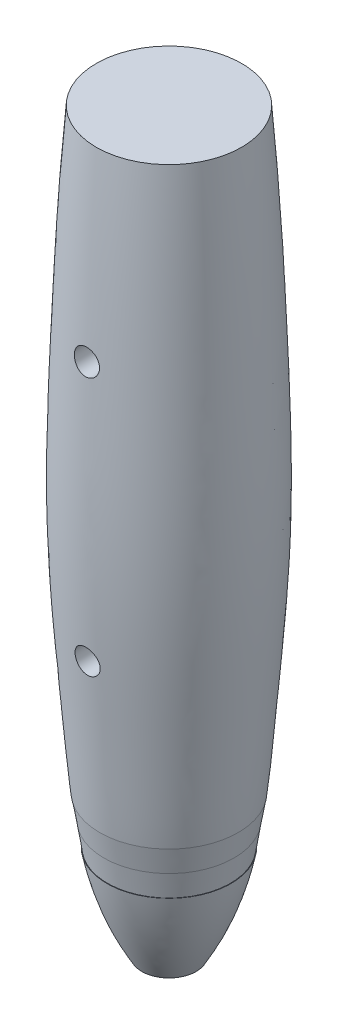
ISO-10303-21;
HEADER;
FILE_DESCRIPTION(('STEP AP214'),'2;1');
FILE_NAME('part.step','',(''),(''),'','','');
FILE_SCHEMA(('AUTOMOTIVE_DESIGN { 1 0 10303 214 1 1 1 1 }'));
ENDSEC;
DATA;
#1=APPLICATION_CONTEXT('core data for automotive mechanical design processes');
#2=APPLICATION_PROTOCOL_DEFINITION('international standard','automotive_design',2000,#1);
#3=PRODUCT_CONTEXT('',#1,'mechanical');
#4=PRODUCT('Part','Part','',(#3));
#5=PRODUCT_RELATED_PRODUCT_CATEGORY('part','',(#4));
#6=PRODUCT_DEFINITION_FORMATION('','',#4);
#7=PRODUCT_DEFINITION_CONTEXT('part definition',#1,'design');
#8=PRODUCT_DEFINITION('design','',#6,#7);
#9=PRODUCT_DEFINITION_SHAPE('','',#8);
#10=(LENGTH_UNIT() NAMED_UNIT(*) SI_UNIT(.MILLI.,.METRE.));
#11=(NAMED_UNIT(*) PLANE_ANGLE_UNIT() SI_UNIT($,.RADIAN.));
#12=(NAMED_UNIT(*) SI_UNIT($,.STERADIAN.) SOLID_ANGLE_UNIT());
#13=UNCERTAINTY_MEASURE_WITH_UNIT(LENGTH_MEASURE(1.E-05),#10,'distance_accuracy_value','');
#14=(GEOMETRIC_REPRESENTATION_CONTEXT(3) GLOBAL_UNCERTAINTY_ASSIGNED_CONTEXT((#13)) GLOBAL_UNIT_ASSIGNED_CONTEXT((#10,
#11,#12)) REPRESENTATION_CONTEXT('',''));
#15=CARTESIAN_POINT('',(0.,0.,0.));
#16=DIRECTION('',(0.,0.,1.));
#17=DIRECTION('',(1.,0.,0.));
#18=AXIS2_PLACEMENT_3D('',#15,#16,#17);
#19=CARTESIAN_POINT('',(0.,790.340820313,-61.387008667));
#20=DIRECTION('',(0.,-1.,0.));
#21=DIRECTION('',(0.,0.,-1.));
#22=AXIS2_PLACEMENT_3D('',#19,#20,#21);
#23=PLANE('',#22);
#24=CARTESIAN_POINT('',(0.,790.340820313,0.));
#25=DIRECTION('',(0.,1.,0.));
#26=DIRECTION('',(0.,0.,1.));
#27=AXIS2_PLACEMENT_3D('',#24,#25,#26);
#28=CIRCLE('',#27,61.387008667);
#29=CARTESIAN_POINT('',(0.,790.340820313,61.387008667));
#30=VERTEX_POINT('',#29);
#31=EDGE_CURVE('E17',#30,#30,#28,.T.);
#32=ORIENTED_EDGE('',*,*,#31,.F.);
#33=EDGE_LOOP('',(#32));
#34=FACE_BOUND('',#33,.T.);
#35=ADVANCED_FACE('F14',(#34),#23,.T.);
#36=CARTESIAN_POINT('',(0.,1001.95002223,-140.174366178));
#37=CARTESIAN_POINT('',(0.,986.483221142,-137.046208978));
#38=CARTESIAN_POINT('',(0.,971.113061691,-133.586775008));
#39=CARTESIAN_POINT('',(0.,955.85359643,-129.756142439));
#40=CARTESIAN_POINT('',(0.,912.421196022,-117.599863487));
#41=CARTESIAN_POINT('',(0.,870.066313188,-101.915123625));
#42=CARTESIAN_POINT('',(0.,842.981803926,-90.0511989518));
#43=CARTESIAN_POINT('',(0.,816.406639634,-76.5418272993));
#44=CARTESIAN_POINT('',(0.,790.340820313,-61.387008667));
#45=(BOUNDED_CURVE() B_SPLINE_CURVE(5,(#36,#37,#38,#39,#40,#41,#42,#43,#44),.UNSPECIFIED.,.F.,
.F.) B_SPLINE_CURVE_WITH_KNOTS((6,3,6),(1455.4877488,1534.58198638,1682.43854308),
.UNSPECIFIED.) CURVE() GEOMETRIC_REPRESENTATION_ITEM() RATIONAL_B_SPLINE_CURVE((1.,1.,1.,1.,1.,
1.,1.,1.,1.)) REPRESENTATION_ITEM(''));
#46=CARTESIAN_POINT('',(0.,1622.67712402,0.));
#47=DIRECTION('',(0.,1.,0.));
#48=AXIS1_PLACEMENT('',#46,#47);
#49=SURFACE_OF_REVOLUTION('',#45,#48);
#50=CARTESIAN_POINT('',(0.,1001.95002223886,0.));
#51=DIRECTION('',(0.,1.,0.));
#52=DIRECTION('',(0.479425538604204,0.,-0.877582561890372));
#53=AXIS2_PLACEMENT_3D('',#50,#51,#52);
#54=CIRCLE('',#53,140.174366176558);
#55=CARTESIAN_POINT('',(67.2031710026992,1001.95002223886,-123.014579380583));
#56=VERTEX_POINT('',#55);
#57=EDGE_CURVE('E29',#56,#56,#54,.F.);
#58=ORIENTED_EDGE('',*,*,#57,.T.);
#59=EDGE_LOOP('',(#58));
#60=FACE_BOUND('',#59,.T.);
#61=ORIENTED_EDGE('',*,*,#31,.T.);
#62=EDGE_LOOP('',(#61));
#63=FACE_BOUND('',#62,.T.);
#64=ADVANCED_FACE('F78',(#60,#63),#49,.F.);
#65=CARTESIAN_POINT('',(0.,1001.95002223886,0.));
#66=DIRECTION('',(0.,1.,0.));
#67=DIRECTION('',(0.,0.,1.));
#68=AXIS2_PLACEMENT_3D('',#65,#66,#67);
#69=CONICAL_SURFACE('',#68,140.174366176558,1.40482936173);
#70=CARTESIAN_POINT('',(0.,1001.74414062994,0.));
#71=DIRECTION('',(0.,1.,0.));
#72=DIRECTION('',(0.479425538604204,0.,-0.877582561890372));
#73=AXIS2_PLACEMENT_3D('',#70,#71,#72);
#74=CIRCLE('',#73,138.945279473991);
#75=CARTESIAN_POINT('',(66.6139154483299,1001.74414062994,-121.935954323359));
#76=VERTEX_POINT('',#75);
#77=EDGE_CURVE('E70',#76,#76,#74,.T.);
#78=ORIENTED_EDGE('',*,*,#77,.F.);
#79=EDGE_LOOP('',(#78));
#80=FACE_BOUND('',#79,.T.);
#81=ORIENTED_EDGE('',*,*,#57,.F.);
#82=EDGE_LOOP('',(#81));
#83=FACE_BOUND('',#82,.T.);
#84=ADVANCED_FACE('F81',(#80,#83),#69,.F.);
#85=CARTESIAN_POINT('',(0.,1055.30861804015,0.));
#86=DIRECTION('',(0.,1.,0.));
#87=DIRECTION('',(0.,0.,1.));
#88=AXIS2_PLACEMENT_3D('',#85,#86,#87);
#89=CONICAL_SURFACE('',#88,147.046676341265,0.150108012671);
#90=CARTESIAN_POINT('',(0.,1055.30861804004,0.));
#91=DIRECTION('',(0.,1.,0.));
#92=DIRECTION('',(0.479425538604204,0.,-0.877582561890372));
#93=AXIS2_PLACEMENT_3D('',#90,#91,#92);
#94=CIRCLE('',#93,147.046676342007);
#95=CARTESIAN_POINT('',(70.4979320052249,1055.30861804004,-129.045598941683));
#96=VERTEX_POINT('',#95);
#97=EDGE_CURVE('E63',#96,#96,#94,.T.);
#98=ORIENTED_EDGE('',*,*,#97,.F.);
#99=EDGE_LOOP('',(#98));
#100=FACE_BOUND('',#99,.T.);
#101=ORIENTED_EDGE('',*,*,#77,.T.);
#102=EDGE_LOOP('',(#101));
#103=FACE_BOUND('',#102,.T.);
#104=ADVANCED_FACE('F85',(#100,#103),#89,.T.);
#105=CARTESIAN_POINT('',(0.,0.,117.));
#106=DIRECTION('',(0.,0.,1.));
#107=DIRECTION('',(1.,0.,0.));
#108=AXIS2_PLACEMENT_3D('',#105,#106,#107);
#109=PLANE('',#108);
#110=CARTESIAN_POINT('',(0.028076171875,2046.74123752,117.));
#111=DIRECTION('',(0.,0.,1.));
#112=DIRECTION('',(1.,0.,0.));
#113=AXIS2_PLACEMENT_3D('',#110,#111,#112);
#114=CIRCLE('',#113,28.4182066159);
#115=CARTESIAN_POINT('',(28.446282787775,2046.74123752,117.));
#116=VERTEX_POINT('',#115);
#117=EDGE_CURVE('E69',#116,#116,#114,.T.);
#118=ORIENTED_EDGE('',*,*,#117,.T.);
#119=EDGE_LOOP('',(#118));
#120=FACE_BOUND('',#119,.T.);
#121=ADVANCED_FACE('F89',(#120),#109,.T.);
#122=CARTESIAN_POINT('',(0.,0.,117.));
#123=DIRECTION('',(0.,0.,1.));
#124=DIRECTION('',(1.,0.,0.));
#125=AXIS2_PLACEMENT_3D('',#122,#123,#124);
#126=PLANE('',#125);
#127=CARTESIAN_POINT('',(0.028076171875,1459.93544728,117.));
#128=DIRECTION('',(0.,0.,1.));
#129=DIRECTION('',(1.,0.,0.));
#130=AXIS2_PLACEMENT_3D('',#127,#128,#129);
#131=CIRCLE('',#130,28.4182066159);
#132=CARTESIAN_POINT('',(28.446282787775,1459.93544728,117.));
#133=VERTEX_POINT('',#132);
#134=EDGE_CURVE('E127',#133,#133,#131,.T.);
#135=ORIENTED_EDGE('',*,*,#134,.T.);
#136=EDGE_LOOP('',(#135));
#137=FACE_BOUND('',#136,.T.);
#138=ADVANCED_FACE('F93',(#137),#126,.T.);
#139=CARTESIAN_POINT('',(0.,1109.85107421989,0.));
#140=DIRECTION('',(0.,1.,0.));
#141=DIRECTION('',(0.,0.,1.));
#142=AXIS2_PLACEMENT_3D('',#139,#140,#141);
#143=CONICAL_SURFACE('',#142,156.119563454498,0.164836084889);
#144=CARTESIAN_POINT('',(0.,1109.85107421989,0.));
#145=DIRECTION('',(0.,1.,0.));
#146=DIRECTION('',(0.,0.,1.));
#147=AXIS2_PLACEMENT_3D('',#144,#145,#146);
#148=CIRCLE('',#147,156.119563454498);
#149=CARTESIAN_POINT('',(0.,1109.85107421989,156.119563454498));
#150=VERTEX_POINT('',#149);
#151=EDGE_CURVE('E125',#150,#150,#148,.T.);
#152=ORIENTED_EDGE('',*,*,#151,.F.);
#153=EDGE_LOOP('',(#152));
#154=FACE_BOUND('',#153,.T.);
#155=ORIENTED_EDGE('',*,*,#97,.T.);
#156=EDGE_LOOP('',(#155));
#157=FACE_BOUND('',#156,.T.);
#158=ADVANCED_FACE('F97',(#154,#157),#143,.T.);
#159=CARTESIAN_POINT('',(0.028076171875,2046.74123752,158.5));
#160=DIRECTION('',(0.,0.,1.));
#161=DIRECTION('',(1.,0.,0.));
#162=AXIS2_PLACEMENT_3D('',#159,#160,#161);
#163=CYLINDRICAL_SURFACE('',#162,28.4182066159);
#164=ORIENTED_EDGE('',*,*,#117,.F.);
#165=EDGE_LOOP('',(#164));
#166=FACE_BOUND('',#165,.T.);
#167=CARTESIAN_POINT('',(28.446282787775,2046.74123752,185.346258582128));
#168=CARTESIAN_POINT('',(28.4462786471396,2045.94483901186,185.378171314834));
#169=CARTESIAN_POINT('',(28.412776814294,2045.14852606646,185.415180715683));
#170=CARTESIAN_POINT('',(28.2790863277804,2043.56172394539,185.498998191778));
#171=CARTESIAN_POINT('',(28.1788659380677,2042.77123772234,185.54581092291));
#172=CARTESIAN_POINT('',(27.9123134906861,2041.20052700142,185.648627538126));
#173=CARTESIAN_POINT('',(27.7458556522178,2040.4203249616,185.704648789137));
#174=CARTESIAN_POINT('',(27.3481878326515,2038.87735512763,185.824844711864));
#175=CARTESIAN_POINT('',(27.1169855922408,2038.11458526112,185.889018408391));
#176=CARTESIAN_POINT('',(26.5919332907841,2036.61266349972,186.02423332169));
#177=CARTESIAN_POINT('',(26.2981641596627,2035.87348249959,186.09526560265));
#178=CARTESIAN_POINT('',(25.6499625507424,2034.42277108482,186.242867620589));
#179=CARTESIAN_POINT('',(25.29552836074,2033.7112414513,186.319437513826));
#180=CARTESIAN_POINT('',(24.5287004592565,2032.32097980089,186.476515647094));
#181=CARTESIAN_POINT('',(24.1163307851379,2031.64223433803,186.557022244806));
#182=CARTESIAN_POINT('',(23.2364008325867,2030.32181025189,186.720316910556));
#183=CARTESIAN_POINT('',(22.7688405604151,2029.68013162439,186.803104978335));
#184=CARTESIAN_POINT('',(21.7772276235138,2028.43250726109,186.969952243131));
#185=CARTESIAN_POINT('',(21.2526992680976,2027.82694015673,187.054016150125));
#186=CARTESIAN_POINT('',(20.1543010474419,2026.6621349152,187.220810110359));
#187=CARTESIAN_POINT('',(19.5804307860762,2026.10289715005,187.303540152884));
#188=CARTESIAN_POINT('',(18.3872138515512,2025.03460627451,187.465817798036));
#189=CARTESIAN_POINT('',(17.767862711789,2024.5255581047,187.545365086902));
#190=CARTESIAN_POINT('',(16.4879727802831,2023.56132748423,187.699457120071));
#191=CARTESIAN_POINT('',(15.8274340855658,2023.10614490669,187.774001876159));
#192=CARTESIAN_POINT('',(14.4686222961379,2022.25226053745,187.916481997108));
#193=CARTESIAN_POINT('',(13.7702901076722,2021.85365094686,187.984406517319));
#194=CARTESIAN_POINT('',(12.3417496670726,2021.1167601951,188.111913243275));
#195=CARTESIAN_POINT('',(11.6115413252425,2020.77847920371,188.171495425543));
#196=CARTESIAN_POINT('',(10.1244951651324,2020.1648628738,188.280893219916));
#197=CARTESIAN_POINT('',(9.36765952609578,2019.88952239785,188.330709629093));
#198=CARTESIAN_POINT('',(7.83276638416964,2019.40391543966,188.419379882596));
#199=CARTESIAN_POINT('',(7.05470915620674,2019.19364811483,188.458233868866));
#200=CARTESIAN_POINT('',(5.49378647217645,2018.84228196039,188.523584764322));
#201=CARTESIAN_POINT('',(4.71113113323639,2018.70027933942,188.550242897892));
#202=CARTESIAN_POINT('',(3.13635739590697,2018.48234712616,188.591337125647));
#203=CARTESIAN_POINT('',(2.3442390798998,2018.40641695907,188.605773326154));
#204=CARTESIAN_POINT('',(0.756351388292667,2018.32124096762,188.622077479251));
#205=CARTESIAN_POINT('',(-0.0394177308019849,2018.31199052802,188.62394630169));
#206=CARTESIAN_POINT('',(-1.62885684669376,2018.3602370134,188.61507478362));
#207=CARTESIAN_POINT('',(-2.42252685544751,2018.41773355736,188.604334515089));
#208=CARTESIAN_POINT('',(-3.99277909366924,2018.59795317343,188.570703639246));
#209=CARTESIAN_POINT('',(-4.76945267247163,2018.71990834399,188.547956079996));
#210=CARTESIAN_POINT('',(-6.30961678236103,2019.02761622009,188.490935317616));
#211=CARTESIAN_POINT('',(-7.0731074364694,2019.21336832994,188.456662222101));
#212=CARTESIAN_POINT('',(-8.58159757403528,2019.6472536634,188.377388568428));
#213=CARTESIAN_POINT('',(-9.32659654833829,2019.89538860258,188.332387715249));
#214=CARTESIAN_POINT('',(-10.7929550980116,2020.45217477324,188.232697549387));
#215=CARTESIAN_POINT('',(-11.5143144803382,2020.76082649878,188.17800815761));
#216=CARTESIAN_POINT('',(-12.9324384953268,2021.43826410684,188.059859551122));
#217=CARTESIAN_POINT('',(-13.6290437125682,2021.80737543469,187.996353174587));
#218=CARTESIAN_POINT('',(-14.9886915329435,2022.60182745464,187.862249545085));
#219=CARTESIAN_POINT('',(-15.6517340561997,2023.02716828055,187.791652275244));
#220=CARTESIAN_POINT('',(-16.9398339892109,2023.93107412261,187.644950796793));
#221=CARTESIAN_POINT('',(-17.5648914919065,2024.40963900852,187.568846601658));
#222=CARTESIAN_POINT('',(-18.772894929141,2025.41668995512,187.412813926477));
#223=CARTESIAN_POINT('',(-19.355840483318,2025.94517646663,187.3328854119));
#224=CARTESIAN_POINT('',(-20.4843355949021,2027.05692072044,187.169709109746));
#225=CARTESIAN_POINT('',(-21.0291781587851,2027.64089161139,187.086429273563));
#226=CARTESIAN_POINT('',(-22.0677895093481,2028.85258368143,186.919566549768));
#227=CARTESIAN_POINT('',(-22.561557391912,2029.48030563467,186.835983656819));
#228=CARTESIAN_POINT('',(-23.4948510853418,2030.77552943468,186.670295578448));
#229=CARTESIAN_POINT('',(-23.9343494046551,2031.44305119118,186.588191159825));
#230=CARTESIAN_POINT('',(-24.7557218814707,2032.8130051342,186.42726502752));
#231=CARTESIAN_POINT('',(-25.1375977151614,2033.51543630444,186.348443218399));
#232=CARTESIAN_POINT('',(-25.8433117071683,2034.95511712427,186.195229670945));
#233=CARTESIAN_POINT('',(-26.1667529969093,2035.69256483631,186.120870360551));
#234=CARTESIAN_POINT('',(-26.7501157789456,2037.1928982233,185.978668786614));
#235=CARTESIAN_POINT('',(-27.010029160956,2037.95578713208,185.910827355846));
#236=CARTESIAN_POINT('',(-27.4638261889925,2039.49995610607,185.783133463842));
#237=CARTESIAN_POINT('',(-27.6578386618087,2040.28119706001,185.723265556499));
#238=CARTESIAN_POINT('',(-27.9789098938061,2041.85761636682,185.612480291133));
#239=CARTESIAN_POINT('',(-28.106001464251,2042.65278769166,185.561558554986));
#240=CARTESIAN_POINT('',(-28.2627125670773,2043.99759900436,185.484086045319));
#241=CARTESIAN_POINT('',(-28.3104674262301,2044.54504345839,185.454930520694));
#242=CARTESIAN_POINT('',(-28.3741779955541,2045.64201992499,185.401333093684));
#243=CARTESIAN_POINT('',(-28.3901332454042,2046.19155196767,185.376891259537));
#244=CARTESIAN_POINT('',(-28.3901264164626,2047.53152425262,185.323204855113));
#245=CARTESIAN_POINT('',(-28.3571370771991,2048.32212828987,185.296540840488));
#246=CARTESIAN_POINT('',(-28.2252893426327,2049.89841228006,185.253330733551));
#247=CARTESIAN_POINT('',(-28.1264003621174,2050.68408977552,185.236789346176));
#248=CARTESIAN_POINT('',(-27.8631381041388,2052.24605230904,185.213639281911));
#249=CARTESIAN_POINT('',(-27.6986443889696,2053.02231735189,185.207048980396));
#250=CARTESIAN_POINT('',(-27.3053539745084,2054.55830200415,185.20339929414));
#251=CARTESIAN_POINT('',(-27.0765648334779,2055.31802354702,185.20633878955));
#252=CARTESIAN_POINT('',(-26.5565682038694,2056.8148805743,185.221014512614));
#253=CARTESIAN_POINT('',(-26.2654213882965,2057.55203722279,185.232742217002));
#254=CARTESIAN_POINT('',(-25.6226590718485,2058.99934649256,185.264029171916));
#255=CARTESIAN_POINT('',(-25.2710418515898,2059.70949834528,185.283588645147));
#256=CARTESIAN_POINT('',(-24.510014420448,2061.0975170668,185.32937540366));
#257=CARTESIAN_POINT('',(-24.1006281274957,2061.7753971424,185.355599933013));
#258=CARTESIAN_POINT('',(-23.2268541959821,2063.09448038297,185.413409835065));
#259=CARTESIAN_POINT('',(-22.7624667056716,2063.73568364679,185.444995193315));
#260=CARTESIAN_POINT('',(-21.7796236737543,2064.97993813093,185.512260368993));
#261=CARTESIAN_POINT('',(-21.2609227204655,2065.58279449356,185.547958851104));
#262=CARTESIAN_POINT('',(-20.1749210733814,2066.74285402099,185.621812054365));
#263=CARTESIAN_POINT('',(-19.6076201662231,2067.30005698534,185.659966786298));
#264=CARTESIAN_POINT('',(-18.4283091486379,2068.36501143127,185.73719439987));
#265=CARTESIAN_POINT('',(-17.8162943265395,2068.87275768823,185.776267377973));
#266=CARTESIAN_POINT('',(-16.5518543394199,2069.83521203175,185.853805101833));
#267=CARTESIAN_POINT('',(-15.8994290478256,2070.28991995217,185.892269845685));
#268=CARTESIAN_POINT('',(-14.5543873525577,2071.14586260784,185.967372459365));
#269=CARTESIAN_POINT('',(-13.8615400769018,2071.5467357965,186.00399703456));
#270=CARTESIAN_POINT('',(-12.4443654965027,2072.2886912069,186.073773478809));
#271=CARTESIAN_POINT('',(-11.7200380424838,2072.62977314507,186.106925331393));
#272=CARTESIAN_POINT('',(-10.2450405351443,2073.24967945818,186.168524799402));
#273=CARTESIAN_POINT('',(-9.49437117427157,2073.52850546822,186.196972538373));
#274=CARTESIAN_POINT('',(-7.97200730338381,2074.02187856287,186.248118948886));
#275=CARTESIAN_POINT('',(-7.2003128832687,2074.23642592227,186.270817645007));
#276=CARTESIAN_POINT('',(-5.64353074148354,2074.599169877,186.309584053135));
#277=CARTESIAN_POINT('',(-4.85848507516515,2074.74754504876,186.325669602504));
#278=CARTESIAN_POINT('',(-3.27857779498826,2074.97769924663,186.350715176336));
#279=CARTESIAN_POINT('',(-2.48371619390008,2075.05947835937,186.359675210068));
#280=CARTESIAN_POINT('',(-0.889903673572894,2075.15583136774,186.370144105381));
#281=CARTESIAN_POINT('',(-0.0909528718049292,2075.17040718319,186.371653179816));
#282=CARTESIAN_POINT('',(1.50531704722503,2075.13225027183,186.367163037609));
#283=CARTESIAN_POINT('',(2.30263616941717,2075.07951774868,186.361163843685));
#284=CARTESIAN_POINT('',(3.88598543142602,2074.90756511574,186.341917191554));
#285=CARTESIAN_POINT('',(4.67205191224974,2074.78867534955,186.328705752484));
#286=CARTESIAN_POINT('',(6.23132540366814,2074.48551573736,186.295526392677));
#287=CARTESIAN_POINT('',(7.00453246074356,2074.30124612775,186.275558496366));
#288=CARTESIAN_POINT('',(8.53265241611609,2073.86866349064,186.229576158054));
#289=CARTESIAN_POINT('',(9.28756486024229,2073.62034887499,186.203561566111));
#290=CARTESIAN_POINT('',(10.7737833009876,2073.06146835418,186.146418180347));
#291=CARTESIAN_POINT('',(11.5050892119025,2072.75090222305,186.11528936796));
#292=CARTESIAN_POINT('',(12.9407233815976,2072.06891152496,186.048963350698));
#293=CARTESIAN_POINT('',(13.6449823656391,2071.69734207136,186.01375652037));
#294=CARTESIAN_POINT('',(15.0197460454601,2070.89650888558,185.940630862055));
#295=CARTESIAN_POINT('',(15.6902506880414,2070.46724506247,185.902712029794));
#296=CARTESIAN_POINT('',(16.9928192040357,2069.55405377392,185.8255844169));
#297=CARTESIAN_POINT('',(17.6248846750981,2069.07012858276,185.786375689983));
#298=CARTESIAN_POINT('',(18.8462149075553,2068.05097025135,185.708170939182));
#299=CARTESIAN_POINT('',(19.4354796022184,2067.51573703111,185.66917491563));
#300=CARTESIAN_POINT('',(20.5699700524786,2066.39484122369,185.592747389672));
#301=CARTESIAN_POINT('',(21.1149577977024,2065.80893709035,185.555324805555));
#302=CARTESIAN_POINT('',(22.1536985436713,2064.59314476379,185.483819053867));
#303=CARTESIAN_POINT('',(22.6474509730905,2063.96325608022,185.449735923537));
#304=CARTESIAN_POINT('',(23.5803944657051,2062.66363969556,185.386408526493));
#305=CARTESIAN_POINT('',(24.0195616188399,2061.99389472478,185.357166378434));
#306=CARTESIAN_POINT('',(24.8399009027789,2060.61957385715,185.304955685803));
#307=CARTESIAN_POINT('',(25.2210749534922,2059.91499911439,185.281986933526));
#308=CARTESIAN_POINT('',(25.9219728651953,2058.4774534907,185.243629589831));
#309=CARTESIAN_POINT('',(26.2418172232153,2057.74454176287,185.228226039758));
#310=CARTESIAN_POINT('',(26.8186938727345,2056.25416641886,185.206003584077));
#311=CARTESIAN_POINT('',(27.0757187392487,2055.49669991239,185.19918569286));
#312=CARTESIAN_POINT('',(27.5246004201879,2053.96425244888,185.194986980698));
#313=CARTESIAN_POINT('',(27.7165802618692,2053.18930754689,185.197588234019));
#314=CARTESIAN_POINT('',(28.0345929467794,2051.62641593325,185.212770418049));
#315=CARTESIAN_POINT('',(28.1606570891469,2050.83847557599,185.225346605149));
#316=CARTESIAN_POINT('',(28.317626317704,2049.49824646909,185.255322978425));
#317=CARTESIAN_POINT('',(28.3658630707981,2048.94786487354,185.270057429334));
#318=CARTESIAN_POINT('',(28.430192529686,2047.84538763897,185.304464489672));
#319=CARTESIAN_POINT('',(28.446285658017,2047.29329202258,185.324137034185));
#320=CARTESIAN_POINT('',(28.446282787775,2046.74123752,185.346258582128));
#321=B_SPLINE_CURVE_WITH_KNOTS('',3,(#167,#168,#169,#170,#171,#172,#173,#174,#175,#176,#177,
#178,#179,#180,#181,#182,#183,#184,#185,#186,#187,#188,#189,#190,#191,#192,#193,#194,#195,#196,
#197,#198,#199,#200,#201,#202,#203,#204,#205,#206,#207,#208,#209,#210,#211,#212,#213,#214,#215,
#216,#217,#218,#219,#220,#221,#222,#223,#224,#225,#226,#227,#228,#229,#230,#231,#232,#233,#234,
#235,#236,#237,#238,#239,#240,#241,#242,#243,#244,#245,#246,#247,#248,#249,#250,#251,#252,#253,
#254,#255,#256,#257,#258,#259,#260,#261,#262,#263,#264,#265,#266,#267,#268,#269,#270,#271,#272,
#273,#274,#275,#276,#277,#278,#279,#280,#281,#282,#283,#284,#285,#286,#287,#288,#289,#290,#291,
#292,#293,#294,#295,#296,#297,#298,#299,#300,#301,#302,#303,#304,#305,#306,#307,#308,#309,#310,
#311,#312,#313,#314,#315,#316,#317,#318,#319,#320),.UNSPECIFIED.,.T.,.F.,(4,2,2,2,2,2,2,2,2,2,2,
2,2,2,2,2,2,2,2,2,2,2,2,2,2,2,2,2,2,2,2,2,2,2,2,2,2,2,2,2,2,2,2,2,2,2,2,2,2,2,2,2,2,2,2,2,2,2,2,
2,2,2,2,2,2,2,2,2,2,2,2,2,2,2,2,2,4),(0.,2.39060253273863,4.78234301770174,7.17864711037366,
9.57466482883527,11.9676019328068,14.3606065858937,16.7526213002828,19.1446357433106,
21.5584338990899,23.9722514351165,26.3863063460836,28.8003555704346,31.2182950448714,
33.6362413235803,36.0539901698625,38.4717077089616,40.856468420436,43.241208385916,
45.6257832900855,48.010344582226,50.3671182514657,52.7238699156967,55.0806863994913,
57.4375221245369,59.8074884986616,62.1774605129327,64.5474267281939,66.9174143467041,
69.3235929447932,71.7298141293948,74.1372492856944,76.544614398268,78.9677606736355,
81.3912161383811,83.8099064583626,86.2274097896346,87.8774164509725,89.5274469971097,
91.8997073622387,94.2730695037155,96.6508088873644,99.0282688722275,101.403426051356,
103.778650775621,106.152894963479,108.527132751925,110.912603528698,113.298084778674,
115.683817759229,118.069558212718,120.47059530069,122.871643775362,125.272629181049,
127.673604322106,130.068060241519,132.462513046122,134.856897446756,137.251274601997,
139.633801806811,142.016320398041,144.398898075761,146.781484402515,149.169813629283,
151.558146620036,153.946380276429,156.334617656293,158.734943626894,161.135296360695,
163.536696846218,165.938017814099,168.334571345952,170.731408002966,173.123685599029,
175.514826221925,177.171986836027,178.829125666133),.UNSPECIFIED.);
#322=CARTESIAN_POINT('',(28.446282787775,2046.74123752,185.346258582128));
#323=VERTEX_POINT('',#322);
#324=EDGE_CURVE('E39',#323,#323,#321,.T.);
#325=ORIENTED_EDGE('',*,*,#324,.F.);
#326=EDGE_LOOP('',(#325));
#327=FACE_BOUND('',#326,.T.);
#328=ADVANCED_FACE('F100',(#166,#327),#163,.F.);
#329=CARTESIAN_POINT('',(0.028076171875,1459.93544728,158.5));
#330=DIRECTION('',(0.,0.,1.));
#331=DIRECTION('',(1.,0.,0.));
#332=AXIS2_PLACEMENT_3D('',#329,#330,#331);
#333=CYLINDRICAL_SURFACE('',#332,28.4182066159);
#334=ORIENTED_EDGE('',*,*,#134,.F.);
#335=EDGE_LOOP('',(#334));
#336=FACE_BOUND('',#335,.T.);
#337=CARTESIAN_POINT('',(28.446282787775,1459.93544727999,183.818235619119));
#338=CARTESIAN_POINT('',(28.4462774821403,1459.14637559806,183.762141780714));
#339=CARTESIAN_POINT('',(28.4133902681603,1458.35682626623,183.710943784396));
#340=CARTESIAN_POINT('',(28.28186933556,1456.78232462613,183.618665961212));
#341=CARTESIAN_POINT('',(28.1832053440584,1455.99737460251,183.577590805175));
#342=CARTESIAN_POINT('',(27.920438007058,1454.43653830851,183.505548422461));
#343=CARTESIAN_POINT('',(27.7562156478648,1453.66067117835,183.474599766239));
#344=CARTESIAN_POINT('',(27.3634346106396,1452.1251580126,183.422669380735));
#345=CARTESIAN_POINT('',(27.1348834622755,1451.36551008975,183.401686485734));
#346=CARTESIAN_POINT('',(26.6152214364509,1449.86839628839,183.369176940913));
#347=CARTESIAN_POINT('',(26.324160730484,1449.13091315796,183.357642742904));
#348=CARTESIAN_POINT('',(25.6814085578567,1447.68274938747,183.343241827234));
#349=CARTESIAN_POINT('',(25.3297153531059,1446.97206951647,183.340375358087));
#350=CARTESIAN_POINT('',(24.5683543896003,1445.58287477345,183.342337279439));
#351=CARTESIAN_POINT('',(24.1587108475964,1444.90434662292,183.347162464293));
#352=CARTESIAN_POINT('',(23.2842417434128,1443.58392485706,183.363356283033));
#353=CARTESIAN_POINT('',(22.819416429642,1442.94203107684,183.374724887463));
#354=CARTESIAN_POINT('',(21.8368141440627,1441.69804041887,183.402759029009));
#355=CARTESIAN_POINT('',(21.3189264837369,1441.09603122939,183.419435798079));
#356=CARTESIAN_POINT('',(20.2346719020223,1439.93751222312,183.4567078102));
#357=CARTESIAN_POINT('',(19.6683048539979,1439.3810025252,183.477303063487));
#358=CARTESIAN_POINT('',(18.4909991516219,1438.31729782369,183.521002894767));
#359=CARTESIAN_POINT('',(17.8800559107046,1437.81010790729,183.544107731098));
#360=CARTESIAN_POINT('',(16.6179111371898,1436.8486282333,183.591418945605));
#361=CARTESIAN_POINT('',(15.9667094442844,1436.39433868637,183.615625328169));
#362=CARTESIAN_POINT('',(14.6242494639264,1435.53906028475,183.663939412927));
#363=CARTESIAN_POINT('',(13.9327593588632,1435.13843513663,183.688045464513));
#364=CARTESIAN_POINT('',(12.5184615290142,1434.39680381418,183.734711517914));
#365=CARTESIAN_POINT('',(11.7956536668172,1434.05579790146,183.757271512943));
#366=CARTESIAN_POINT('',(10.3238329996702,1433.43583408623,183.799691511151));
#367=CARTESIAN_POINT('',(9.57482052678249,1433.15687539778,183.819551548528));
#368=CARTESIAN_POINT('',(8.05588565980404,1432.66299765216,183.855588744435));
#369=CARTESIAN_POINT('',(7.28596330323579,1432.44807848007,183.871765909574));
#370=CARTESIAN_POINT('',(5.73054646682671,1432.08379725547,183.899657684607));
#371=CARTESIAN_POINT('',(4.9450494145168,1431.93444612869,183.911371550729));
#372=CARTESIAN_POINT('',(3.36420718133804,1431.70243613217,183.929776381906));
#373=CARTESIAN_POINT('',(2.56886199508735,1431.61977729886,183.936467344215));
#374=CARTESIAN_POINT('',(0.974020807194115,1431.52175467204,183.944513419835));
#375=CARTESIAN_POINT('',(0.174524871071708,1431.50638981951,183.945868617116));
#376=CARTESIAN_POINT('',(-1.42290918839702,1431.54306465705,183.94318415664));
#377=CARTESIAN_POINT('',(-2.22084731496196,1431.59510420771,183.93914451004));
#378=CARTESIAN_POINT('',(-3.80719920473961,1431.76596467234,183.92588570158));
#379=CARTESIAN_POINT('',(-4.59563359905748,1431.8845952687,183.916681300647));
#380=CARTESIAN_POINT('',(-6.1596832828904,1432.18764337346,183.893545115282));
#381=CARTESIAN_POINT('',(-6.93529859649195,1432.37206075822,183.879613339733));
#382=CARTESIAN_POINT('',(-8.46824003778971,1432.8053623091,183.847695727662));
#383=CARTESIAN_POINT('',(-9.2255657392829,1433.05424797594,183.829709796767));
#384=CARTESIAN_POINT('',(-10.7165697206728,1433.61470720234,183.790568877766));
#385=CARTESIAN_POINT('',(-11.4502479489033,1433.92628089885,183.769413882737));
#386=CARTESIAN_POINT('',(-12.8898479525766,1434.61040535945,183.724970687113));
#387=CARTESIAN_POINT('',(-13.5957276849361,1434.98304439501,183.701679420266));
#388=CARTESIAN_POINT('',(-14.9736314020295,1435.78634342247,183.654213947125));
#389=CARTESIAN_POINT('',(-15.6456553435099,1436.21700348849,183.630039739702));
#390=CARTESIAN_POINT('',(-16.9510851280745,1437.1332885405,183.582147043681));
#391=CARTESIAN_POINT('',(-17.5844931614063,1437.61891040466,183.55842852929));
#392=CARTESIAN_POINT('',(-18.8082723975586,1438.64173016873,183.512854449992));
#393=CARTESIAN_POINT('',(-19.3986436323129,1439.17892803037,183.490998883703));
#394=CARTESIAN_POINT('',(-20.5333527247354,1440.30229167034,183.450544478488));
#395=CARTESIAN_POINT('',(-21.0775928285747,1440.88855644779,183.431952470153));
#396=CARTESIAN_POINT('',(-22.1147940074403,1442.10495035396,183.399505437362));
#397=CARTESIAN_POINT('',(-22.6077546205429,1442.73507987771,183.385650455576));
#398=CARTESIAN_POINT('',(-23.5390509559294,1444.03499069577,183.364030292377));
#399=CARTESIAN_POINT('',(-23.9773637820633,1444.70478843793,183.356267656351));
#400=CARTESIAN_POINT('',(-24.7959495401908,1446.07897577496,183.348085024788));
#401=CARTESIAN_POINT('',(-25.1762244065053,1446.78336421592,183.347664784486));
#402=CARTESIAN_POINT('',(-25.8747427644365,1448.21907216505,183.355233367534));
#403=CARTESIAN_POINT('',(-26.1932047725757,1448.95028552128,183.363191904997));
#404=CARTESIAN_POINT('',(-26.7675556083612,1450.43683901949,183.38834064368));
#405=CARTESIAN_POINT('',(-27.0234372155145,1451.19218193417,183.405531909438));
#406=CARTESIAN_POINT('',(-27.4703582035305,1452.71998240992,183.449734502959));
#407=CARTESIAN_POINT('',(-27.6615177749625,1453.49240537818,183.476727433332));
#408=CARTESIAN_POINT('',(-27.9782878617265,1455.04984698724,183.54089272552));
#409=CARTESIAN_POINT('',(-28.103928970659,1455.83485957254,183.578060323926));
#410=CARTESIAN_POINT('',(-28.2609870579139,1457.17319902395,183.649839207929));
#411=CARTESIAN_POINT('',(-28.3094132578131,1457.72473218095,183.68181901786));
#412=CARTESIAN_POINT('',(-28.3739860108737,1458.82936394146,183.750702031066));
#413=CARTESIAN_POINT('',(-28.3901333250647,1459.38246250775,183.787605118244));
#414=CARTESIAN_POINT('',(-28.3901262768508,1460.73529187895,183.883777103801));
#415=CARTESIAN_POINT('',(-28.3563340956771,1461.53489840801,183.945676170813));
#416=CARTESIAN_POINT('',(-28.2215585381344,1463.12794970362,184.078948360258));
#417=CARTESIAN_POINT('',(-28.1205428998612,1463.92139132644,184.150326018488));
#418=CARTESIAN_POINT('',(-27.851958076597,1465.49769040911,184.301785474776));
#419=CARTESIAN_POINT('',(-27.6842605740764,1466.2805244354,184.381883837219));
#420=CARTESIAN_POINT('',(-27.283725610068,1467.82841944043,184.549504716931));
#421=CARTESIAN_POINT('',(-27.0508959923932,1468.5934825473,184.637026339339));
#422=CARTESIAN_POINT('',(-26.5222543508398,1470.09962664112,184.818003290412));
#423=CARTESIAN_POINT('',(-26.2265276537306,1470.84073856695,184.911450461074));
#424=CARTESIAN_POINT('',(-25.5740808536353,1472.29502700252,185.102830523438));
#425=CARTESIAN_POINT('',(-25.2173590252964,1473.00820272135,185.200763541972));
#426=CARTESIAN_POINT('',(-24.4456259490277,1474.40148726458,185.399367286316));
#427=CARTESIAN_POINT('',(-24.0306391206055,1475.08160978201,185.500036851028));
#428=CARTESIAN_POINT('',(-23.1451281990946,1476.40452847405,185.702342044069));
#429=CARTESIAN_POINT('',(-22.6746041100961,1477.04732465141,185.803977672327));
#430=CARTESIAN_POINT('',(-21.6763978700807,1478.29725836432,186.007312410966));
#431=CARTESIAN_POINT('',(-21.1482080460039,1478.90399202102,186.109002672776));
#432=CARTESIAN_POINT('',(-20.0420402683763,1480.07076809988,186.309486397217));
#433=CARTESIAN_POINT('',(-19.4640618699658,1480.63081010478,186.408279833955));
#434=CARTESIAN_POINT('',(-18.2621842714593,1481.7002803305,186.601022267251));
#435=CARTESIAN_POINT('',(-17.6382810240178,1482.20970408104,186.69497083559));
#436=CARTESIAN_POINT('',(-16.3488528677969,1483.1741834737,186.87611096426));
#437=CARTESIAN_POINT('',(-15.6833282044479,1483.62923943637,186.963302564429));
#438=CARTESIAN_POINT('',(-14.3167132948136,1484.48067546771,187.128945926393));
#439=CARTESIAN_POINT('',(-13.6157024832104,1484.87717942707,187.20741605235));
#440=CARTESIAN_POINT('',(-12.181697930839,1485.60963830791,187.354178955509));
#441=CARTESIAN_POINT('',(-11.4487041631908,1485.94559317849,187.422471724158));
#442=CARTESIAN_POINT('',(-9.95603987609167,1486.55426484747,187.547405548461));
#443=CARTESIAN_POINT('',(-9.19637228170822,1486.82698855505,187.604047877067));
#444=CARTESIAN_POINT('',(-7.6558145040134,1487.30702365349,187.704450445642));
#445=CARTESIAN_POINT('',(-6.87492467889047,1487.51433614761,187.748210902884));
#446=CARTESIAN_POINT('',(-5.312530388114,1487.85855996215,187.821186869011));
#447=CARTESIAN_POINT('',(-4.53131305665365,1487.99672067718,187.850660175955));
#448=CARTESIAN_POINT('',(-2.95966863087121,1488.20727815527,187.895632742272));
#449=CARTESIAN_POINT('',(-2.16924165054549,1488.27967573148,187.911132174427));
#450=CARTESIAN_POINT('',(-0.585019064341338,1488.35810572132,187.92781781501));
#451=CARTESIAN_POINT('',(0.208776249622275,1488.36414377301,187.929005239422));
#452=CARTESIAN_POINT('',(1.79398015111972,1488.30981938104,187.917042342623));
#453=CARTESIAN_POINT('',(2.58538875412619,1488.24945736877,187.903892114561));
#454=CARTESIAN_POINT('',(4.14882750319001,1488.06416442642,187.863826284171));
#455=CARTESIAN_POINT('',(4.92097319419512,1487.94016360155,187.837109026848));
#456=CARTESIAN_POINT('',(6.45187349622602,1487.62911781229,187.770579451362));
#457=CARTESIAN_POINT('',(7.21062826306336,1487.44207358197,187.730767285673));
#458=CARTESIAN_POINT('',(8.7094990782067,1487.00640031548,187.638872782063));
#459=CARTESIAN_POINT('',(9.44961459358752,1486.75776952066,187.586790093748));
#460=CARTESIAN_POINT('',(10.906135045188,1486.20082812317,187.471421673403));
#461=CARTESIAN_POINT('',(11.6225397424059,1485.89251691914,187.408135828487));
#462=CARTESIAN_POINT('',(13.0318174142858,1485.21611978058,187.271151948091));
#463=CARTESIAN_POINT('',(13.7244874386685,1484.84762538017,187.197383243746));
#464=CARTESIAN_POINT('',(15.0762903143582,1484.05514023465,187.041256679068));
#465=CARTESIAN_POINT('',(15.7354230713094,1483.6311493334,186.958898794572));
#466=CARTESIAN_POINT('',(17.0158457113445,1482.73068230151,186.787212127573));
#467=CARTESIAN_POINT('',(17.6371351824526,1482.25420559965,186.697883269207));
#468=CARTESIAN_POINT('',(18.8378544759984,1481.25206632439,186.513975175168));
#469=CARTESIAN_POINT('',(19.4172837927978,1480.72640315704,186.419395876099));
#470=CARTESIAN_POINT('',(20.5415796011944,1479.61857887136,186.224862819106));
#471=CARTESIAN_POINT('',(21.0855366513012,1479.03550645507,186.124839784318));
#472=CARTESIAN_POINT('',(22.122420382392,1477.82592231386,185.923104802151));
#473=CARTESIAN_POINT('',(22.6153460229704,1477.19940970374,185.821392820386));
#474=CARTESIAN_POINT('',(23.5471567683782,1475.90674200001,185.618113660773));
#475=CARTESIAN_POINT('',(23.986012787008,1475.24056585312,185.516546589663));
#476=CARTESIAN_POINT('',(24.6011172263035,1474.21547021616,185.365775407807));
#477=CARTESIAN_POINT('',(24.7989607663841,1473.86945558997,185.315780098006));
#478=CARTESIAN_POINT('',(25.1800173145011,1473.16923865057,185.216512806293));
#479=CARTESIAN_POINT('',(25.3632264624003,1472.8150342087,185.167241018003));
#480=CARTESIAN_POINT('',(25.8942086518774,1471.73322603181,185.019777310131));
#481=CARTESIAN_POINT('',(26.2188426020104,1470.99390957998,184.923043819494));
#482=CARTESIAN_POINT('',(26.8042187195824,1469.48970974871,184.735172305897));
#483=CARTESIAN_POINT('',(27.0649616638492,1468.72482668026,184.644034214914));
#484=CARTESIAN_POINT('',(27.4064181819406,1467.56325931848,184.512742043215));
#485=CARTESIAN_POINT('',(27.5118974695241,1467.17400687322,184.469911915437));
#486=CARTESIAN_POINT('',(27.7062217567456,1466.39123976131,184.386188857842));
#487=CARTESIAN_POINT('',(27.7950707394794,1465.99772613919,184.345295465919));
#488=CARTESIAN_POINT('',(27.9559386281045,1465.20722198369,184.265606149799));
#489=CARTESIAN_POINT('',(28.0279638412901,1464.81023281142,184.226809443754));
#490=CARTESIAN_POINT('',(28.1550736409279,1464.01335037878,184.151432851163));
#491=CARTESIAN_POINT('',(28.210158156637,1463.6134571063,184.114852973874));
#492=CARTESIAN_POINT('',(28.3197836995422,1462.66910322405,184.031457246778));
#493=CARTESIAN_POINT('',(28.3671919582586,1462.12371004217,183.985616734352));
#494=CARTESIAN_POINT('',(28.4304437341679,1461.03077043166,183.898476146184));
#495=CARTESIAN_POINT('',(28.4462864709676,1460.48322395013,183.857176182722));
#496=CARTESIAN_POINT('',(28.446282787775,1459.93544727999,183.818235619119));
#497=B_SPLINE_CURVE_WITH_KNOTS('',3,(#337,#338,#339,#340,#341,#342,#343,#344,#345,#346,#347,
#348,#349,#350,#351,#352,#353,#354,#355,#356,#357,#358,#359,#360,#361,#362,#363,#364,#365,#366,
#367,#368,#369,#370,#371,#372,#373,#374,#375,#376,#377,#378,#379,#380,#381,#382,#383,#384,#385,
#386,#387,#388,#389,#390,#391,#392,#393,#394,#395,#396,#397,#398,#399,#400,#401,#402,#403,#404,
#405,#406,#407,#408,#409,#410,#411,#412,#413,#414,#415,#416,#417,#418,#419,#420,#421,#422,#423,
#424,#425,#426,#427,#428,#429,#430,#431,#432,#433,#434,#435,#436,#437,#438,#439,#440,#441,#442,
#443,#444,#445,#446,#447,#448,#449,#450,#451,#452,#453,#454,#455,#456,#457,#458,#459,#460,#461,
#462,#463,#464,#465,#466,#467,#468,#469,#470,#471,#472,#473,#474,#475,#476,#477,#478,#479,#480,
#481,#482,#483,#484,#485,#486,#487,#488,#489,#490,#491,#492,#493,#494,#495,#496),.UNSPECIFIED.,
.T.,.F.,(4,2,2,2,2,2,2,2,2,2,2,2,2,2,2,2,2,2,2,2,2,2,2,2,2,2,2,2,2,2,2,2,2,2,2,2,2,2,2,2,2,2,2,
2,2,2,2,2,2,2,2,2,2,2,2,2,2,2,2,2,2,2,2,2,2,2,2,2,2,2,2,2,2,2,2,2,2,2,2,4),(0.,2.37271134456236,
4.7465154523193,7.12464866988985,9.5025036432741,11.8784571852867,14.2544788476813,
16.6295105161869,19.0045314935472,21.384611747925,23.7646982196303,26.1450299311932,
28.5253711217732,30.9211064475321,33.3168522859925,35.7125677767842,38.1082789687868,
40.5043892116542,42.9005007640144,45.2965746077502,47.6926434956746,50.081899017316,
52.4711500491379,54.860456704083,57.2497685789582,59.6425652332409,62.035364944434,
64.4280288124298,66.8206909050347,69.2183026027611,71.6159358962119,74.0145703902775,
76.4131249238744,78.8030393239608,81.1932293411324,83.5789560483403,85.9635677496247,
87.6263927318729,89.2891785097349,91.6942541834933,94.1004849351848,96.5113686390547,
98.9219621268656,101.329306005419,103.736717991133,106.143123999055,108.549529829749,
110.979153179266,113.408798239661,115.838657681026,118.268502795512,120.693130554004,
123.117760350315,125.542125085647,127.966448927974,130.345229360786,132.723980380444,
135.102529294005,137.481062754538,139.825783176218,142.170476297639,144.515236381549,
146.860020093128,149.221435145819,151.582856841891,153.944304240673,156.305780159145,
158.713928601104,161.12212612966,163.531613519017,164.736430018339,165.941563271778,
168.378138110405,170.814683322124,172.03105181323,173.247128600173,174.462748740977,
175.678373958045,177.325478799928,178.972624362618),.UNSPECIFIED.);
#498=CARTESIAN_POINT('',(28.446282787775,1459.93544727999,183.818235619119));
#499=VERTEX_POINT('',#498);
#500=EDGE_CURVE('E26',#499,#499,#497,.T.);
#501=ORIENTED_EDGE('',*,*,#500,.F.);
#502=EDGE_LOOP('',(#501));
#503=FACE_BOUND('',#502,.T.);
#504=ADVANCED_FACE('F45',(#336,#503),#333,.F.);
#505=CARTESIAN_POINT('',(0.,1109.85107422,-156.528013548));
#506=DIRECTION('',(0.,-1.,0.));
#507=DIRECTION('',(0.,0.,-1.));
#508=AXIS2_PLACEMENT_3D('',#505,#506,#507);
#509=PLANE('',#508);
#510=ORIENTED_EDGE('',*,*,#151,.T.);
#511=EDGE_LOOP('',(#510));
#512=FACE_BOUND('',#511,.T.);
#513=CARTESIAN_POINT('',(0.,1109.85107422,0.));
#514=DIRECTION('',(0.,1.,0.));
#515=DIRECTION('',(0.,0.,1.));
#516=AXIS2_PLACEMENT_3D('',#513,#514,#515);
#517=CIRCLE('',#516,156.528013548);
#518=CARTESIAN_POINT('',(0.,1109.85107422,156.528013548));
#519=VERTEX_POINT('',#518);
#520=EDGE_CURVE('E21',#519,#519,#517,.T.);
#521=ORIENTED_EDGE('',*,*,#520,.F.);
#522=EDGE_LOOP('',(#521));
#523=FACE_BOUND('',#522,.T.);
#524=ADVANCED_FACE('F109',(#512,#523),#509,.T.);
#525=CARTESIAN_POINT('',(0.,2455.01342773,0.));
#526=DIRECTION('',(0.,-1.,0.));
#527=DIRECTION('',(0.,0.,-1.));
#528=AXIS2_PLACEMENT_3D('',#525,#526,#527);
#529=PLANE('',#528);
#530=CARTESIAN_POINT('',(0.,2455.01342773,0.));
#531=DIRECTION('',(0.,1.,0.));
#532=DIRECTION('',(0.,0.,1.));
#533=AXIS2_PLACEMENT_3D('',#530,#531,#532);
#534=CIRCLE('',#533,164.24571228);
#535=CARTESIAN_POINT('',(0.,2455.01342773,164.24571228));
#536=VERTEX_POINT('',#535);
#537=EDGE_CURVE('E10',#536,#536,#534,.F.);
#538=ORIENTED_EDGE('',*,*,#537,.F.);
#539=EDGE_LOOP('',(#538));
#540=FACE_BOUND('',#539,.T.);
#541=ADVANCED_FACE('F54',(#540),#529,.F.);
#542=CARTESIAN_POINT('',(0.,2455.01342773,-164.24571228));
#543=CARTESIAN_POINT('',(0.,2421.41841638,-166.974455416));
#544=CARTESIAN_POINT('',(0.,2387.82921383,-169.513526551));
#545=CARTESIAN_POINT('',(0.,2354.24582008,-171.862925687));
#546=CARTESIAN_POINT('',(0.,2258.07279329,-178.048823094));
#547=CARTESIAN_POINT('',(0.,2161.89915929,-182.837177524));
#548=CARTESIAN_POINT('',(0.,2099.26495271,-185.486848718));
#549=CARTESIAN_POINT('',(0.,1947.2115069,-191.641493929));
#550=CARTESIAN_POINT('',(0.,1794.59274535,-196.081297144));
#551=CARTESIAN_POINT('',(0.,1704.94134837,-197.568173388));
#552=CARTESIAN_POINT('',(0.,1549.16737845,-193.400191836));
#553=CARTESIAN_POINT('',(0.,1394.12779958,-181.451062208));
#554=CARTESIAN_POINT('',(0.,1327.48170929,-175.453678823));
#555=CARTESIAN_POINT('',(0.,1243.5416043,-169.234065119));
#556=CARTESIAN_POINT('',(0.,1159.51064545,-161.664602039));
#557=CARTESIAN_POINT('',(0.,1142.93086096,-160.090053353));
#558=CARTESIAN_POINT('',(0.,1126.37217202,-158.393435347));
#559=CARTESIAN_POINT('',(0.,1109.85107422,-156.528013548));
#560=(BOUNDED_CURVE() B_SPLINE_CURVE(5,(#542,#543,#544,#545,#546,#547,#548,#549,#550,#551,#552,
#553,#554,#555,#556,#557,#558,#559),.UNSPECIFIED.,.F.,.F.) B_SPLINE_CURVE_WITH_KNOTS((6,3,3,3,3,
6),(0.,168.334578048,482.14443981,928.362457388,1264.05353746,1346.6074145),
.UNSPECIFIED.) CURVE() GEOMETRIC_REPRESENTATION_ITEM() RATIONAL_B_SPLINE_CURVE((1.,1.,1.,1.,1.,
1.,1.,1.,1.,1.,1.,1.,1.,1.,1.,1.,1.,1.)) REPRESENTATION_ITEM(''));
#561=CARTESIAN_POINT('',(0.,1622.67712402,0.));
#562=DIRECTION('',(0.,1.,0.));
#563=AXIS1_PLACEMENT('',#561,#562);
#564=SURFACE_OF_REVOLUTION('',#560,#563);
#565=ORIENTED_EDGE('',*,*,#537,.T.);
#566=EDGE_LOOP('',(#565));
#567=FACE_BOUND('',#566,.T.);
#568=ORIENTED_EDGE('',*,*,#520,.T.);
#569=EDGE_LOOP('',(#568));
#570=FACE_BOUND('',#569,.T.);
#571=ORIENTED_EDGE('',*,*,#500,.T.);
#572=EDGE_LOOP('',(#571));
#573=FACE_BOUND('',#572,.T.);
#574=ORIENTED_EDGE('',*,*,#324,.T.);
#575=EDGE_LOOP('',(#574));
#576=FACE_BOUND('',#575,.T.);
#577=ADVANCED_FACE('F52',(#567,#570,#573,#576),#564,.F.);
#578=CLOSED_SHELL('',(#35,#64,#84,#104,#121,#138,#158,#328,#504,#524,#541,#577));
#579=MANIFOLD_SOLID_BREP('B1',#578);
#580=ADVANCED_BREP_SHAPE_REPRESENTATION('',(#18,#579),#14);
#581=SHAPE_DEFINITION_REPRESENTATION(#9,#580);
ENDSEC;
END-ISO-10303-21;
